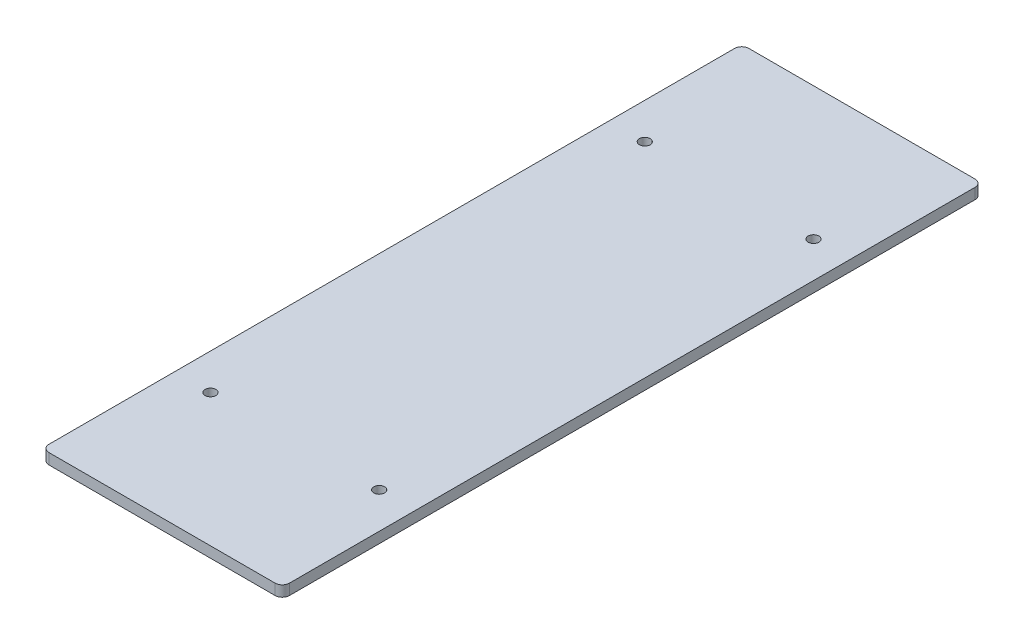
ISO-10303-21;
HEADER;
FILE_DESCRIPTION(('STEP AP214'),'2;1');
FILE_NAME('part.step','',(''),(''),'','','');
FILE_SCHEMA(('AUTOMOTIVE_DESIGN { 1 0 10303 214 1 1 1 1 }'));
ENDSEC;
DATA;
#1=APPLICATION_CONTEXT('core data for automotive mechanical design processes');
#2=APPLICATION_PROTOCOL_DEFINITION('international standard','automotive_design',2000,#1);
#3=PRODUCT_CONTEXT('',#1,'mechanical');
#4=PRODUCT('Part','Part','',(#3));
#5=PRODUCT_RELATED_PRODUCT_CATEGORY('part','',(#4));
#6=PRODUCT_DEFINITION_FORMATION('','',#4);
#7=PRODUCT_DEFINITION_CONTEXT('part definition',#1,'design');
#8=PRODUCT_DEFINITION('design','',#6,#7);
#9=PRODUCT_DEFINITION_SHAPE('','',#8);
#10=(LENGTH_UNIT() NAMED_UNIT(*) SI_UNIT(.MILLI.,.METRE.));
#11=(NAMED_UNIT(*) PLANE_ANGLE_UNIT() SI_UNIT($,.RADIAN.));
#12=(NAMED_UNIT(*) SI_UNIT($,.STERADIAN.) SOLID_ANGLE_UNIT());
#13=UNCERTAINTY_MEASURE_WITH_UNIT(LENGTH_MEASURE(1.E-05),#10,'distance_accuracy_value','');
#14=(GEOMETRIC_REPRESENTATION_CONTEXT(3) GLOBAL_UNCERTAINTY_ASSIGNED_CONTEXT((#13)) GLOBAL_UNIT_ASSIGNED_CONTEXT((#10,
#11,#12)) REPRESENTATION_CONTEXT('',''));
#15=CARTESIAN_POINT('',(0.,0.,0.));
#16=DIRECTION('',(0.,0.,1.));
#17=DIRECTION('',(1.,0.,0.));
#18=AXIS2_PLACEMENT_3D('',#15,#16,#17);
#19=CARTESIAN_POINT('',(0.,3.,0.));
#20=DIRECTION('',(0.,1.,0.));
#21=DIRECTION('',(0.,0.,1.));
#22=AXIS2_PLACEMENT_3D('',#19,#20,#21);
#23=PLANE('',#22);
#24=CARTESIAN_POINT('',(23.5,3.,60.5));
#25=DIRECTION('',(0.,1.,0.));
#26=DIRECTION('',(0.,0.,1.));
#27=AXIS2_PLACEMENT_3D('',#24,#25,#26);
#28=CIRCLE('',#27,1.5);
#29=CARTESIAN_POINT('',(23.5,3.,62.));
#30=VERTEX_POINT('',#29);
#31=EDGE_CURVE('E184',#30,#30,#28,.F.);
#32=ORIENTED_EDGE('',*,*,#31,.T.);
#33=EDGE_LOOP('',(#32));
#34=FACE_BOUND('',#33,.T.);
#35=CARTESIAN_POINT('',(-23.5,3.,-60.5));
#36=DIRECTION('',(0.,1.,0.));
#37=DIRECTION('',(0.,0.,1.));
#38=AXIS2_PLACEMENT_3D('',#35,#36,#37);
#39=CIRCLE('',#38,1.5);
#40=CARTESIAN_POINT('',(-23.5,3.,-59.));
#41=VERTEX_POINT('',#40);
#42=EDGE_CURVE('E178',#41,#41,#39,.F.);
#43=ORIENTED_EDGE('',*,*,#42,.T.);
#44=EDGE_LOOP('',(#43));
#45=FACE_BOUND('',#44,.T.);
#46=DIRECTION('',(0.,0.,-1.));
#47=VECTOR('',#46,1.);
#48=CARTESIAN_POINT('',(33.5,3.,-97.5));
#49=LINE('',#48,#47);
#50=CARTESIAN_POINT('',(33.5,3.,95.5));
#51=VERTEX_POINT('',#50);
#52=CARTESIAN_POINT('',(33.5,3.,-95.5));
#53=VERTEX_POINT('',#52);
#54=EDGE_CURVE('E138',#51,#53,#49,.T.);
#55=ORIENTED_EDGE('',*,*,#54,.T.);
#56=CARTESIAN_POINT('',(31.5,3.,-95.5));
#57=DIRECTION('',(0.,1.,0.));
#58=DIRECTION('',(0.,0.,1.));
#59=AXIS2_PLACEMENT_3D('',#56,#57,#58);
#60=CIRCLE('',#59,2.);
#61=CARTESIAN_POINT('',(31.5,3.,-97.5));
#62=VERTEX_POINT('',#61);
#63=EDGE_CURVE('E153',#53,#62,#60,.T.);
#64=ORIENTED_EDGE('',*,*,#63,.T.);
#65=DIRECTION('',(-1.,0.,0.));
#66=VECTOR('',#65,1.);
#67=CARTESIAN_POINT('',(-33.5,3.,-97.5));
#68=LINE('',#67,#66);
#69=CARTESIAN_POINT('',(-31.5,3.,-97.5));
#70=VERTEX_POINT('',#69);
#71=EDGE_CURVE('E120',#62,#70,#68,.T.);
#72=ORIENTED_EDGE('',*,*,#71,.T.);
#73=CARTESIAN_POINT('',(-31.5,3.,-95.5));
#74=DIRECTION('',(0.,1.,0.));
#75=DIRECTION('',(0.,0.,1.));
#76=AXIS2_PLACEMENT_3D('',#73,#74,#75);
#77=CIRCLE('',#76,2.);
#78=CARTESIAN_POINT('',(-33.5,3.,-95.5));
#79=VERTEX_POINT('',#78);
#80=EDGE_CURVE('E148',#70,#79,#77,.T.);
#81=ORIENTED_EDGE('',*,*,#80,.T.);
#82=DIRECTION('',(0.,0.,1.));
#83=VECTOR('',#82,1.);
#84=CARTESIAN_POINT('',(-33.5,3.,-97.5));
#85=LINE('',#84,#83);
#86=CARTESIAN_POINT('',(-33.5,3.,95.5));
#87=VERTEX_POINT('',#86);
#88=EDGE_CURVE('E164',#79,#87,#85,.T.);
#89=ORIENTED_EDGE('',*,*,#88,.T.);
#90=CARTESIAN_POINT('',(-31.5,3.,95.5));
#91=DIRECTION('',(0.,1.,0.));
#92=DIRECTION('',(0.,0.,1.));
#93=AXIS2_PLACEMENT_3D('',#90,#91,#92);
#94=CIRCLE('',#93,2.);
#95=CARTESIAN_POINT('',(-31.5,3.,97.5));
#96=VERTEX_POINT('',#95);
#97=EDGE_CURVE('E56',#87,#96,#94,.T.);
#98=ORIENTED_EDGE('',*,*,#97,.T.);
#99=DIRECTION('',(1.,0.,0.));
#100=VECTOR('',#99,1.);
#101=CARTESIAN_POINT('',(-33.5,3.,97.5));
#102=LINE('',#101,#100);
#103=CARTESIAN_POINT('',(31.5,3.,97.5));
#104=VERTEX_POINT('',#103);
#105=EDGE_CURVE('E139',#96,#104,#102,.T.);
#106=ORIENTED_EDGE('',*,*,#105,.T.);
#107=CARTESIAN_POINT('',(31.5,3.,95.5));
#108=DIRECTION('',(0.,1.,0.));
#109=DIRECTION('',(0.,0.,1.));
#110=AXIS2_PLACEMENT_3D('',#107,#108,#109);
#111=CIRCLE('',#110,2.);
#112=EDGE_CURVE('E151',#104,#51,#111,.T.);
#113=ORIENTED_EDGE('',*,*,#112,.T.);
#114=EDGE_LOOP('',(#55,#64,#72,#81,#89,#98,#106,#113));
#115=FACE_BOUND('',#114,.T.);
#116=CARTESIAN_POINT('',(-23.5,3.,60.5));
#117=DIRECTION('',(0.,1.,0.));
#118=DIRECTION('',(0.,0.,1.));
#119=AXIS2_PLACEMENT_3D('',#116,#117,#118);
#120=CIRCLE('',#119,1.5);
#121=CARTESIAN_POINT('',(-23.5,3.,62.));
#122=VERTEX_POINT('',#121);
#123=EDGE_CURVE('E190',#122,#122,#120,.T.);
#124=ORIENTED_EDGE('',*,*,#123,.F.);
#125=EDGE_LOOP('',(#124));
#126=FACE_BOUND('',#125,.T.);
#127=CARTESIAN_POINT('',(23.5,3.,-60.5));
#128=DIRECTION('',(0.,1.,0.));
#129=DIRECTION('',(0.,0.,1.));
#130=AXIS2_PLACEMENT_3D('',#127,#128,#129);
#131=CIRCLE('',#130,1.5);
#132=CARTESIAN_POINT('',(23.5,3.,-59.));
#133=VERTEX_POINT('',#132);
#134=EDGE_CURVE('E196',#133,#133,#131,.T.);
#135=ORIENTED_EDGE('',*,*,#134,.F.);
#136=EDGE_LOOP('',(#135));
#137=FACE_BOUND('',#136,.T.);
#138=ADVANCED_FACE('F34',(#34,#45,#115,#126,#137),#23,.T.);
#139=CARTESIAN_POINT('',(0.,0.,0.));
#140=DIRECTION('',(0.,1.,0.));
#141=DIRECTION('',(0.,0.,1.));
#142=AXIS2_PLACEMENT_3D('',#139,#140,#141);
#143=PLANE('',#142);
#144=CARTESIAN_POINT('',(-23.5,0.,60.5));
#145=DIRECTION('',(0.,1.,0.));
#146=DIRECTION('',(0.,0.,1.));
#147=AXIS2_PLACEMENT_3D('',#144,#145,#146);
#148=CIRCLE('',#147,1.5);
#149=CARTESIAN_POINT('',(-23.5,0.,62.));
#150=VERTEX_POINT('',#149);
#151=EDGE_CURVE('E193',#150,#150,#148,.T.);
#152=ORIENTED_EDGE('',*,*,#151,.T.);
#153=EDGE_LOOP('',(#152));
#154=FACE_BOUND('',#153,.T.);
#155=CARTESIAN_POINT('',(23.5,0.,60.5));
#156=DIRECTION('',(0.,1.,0.));
#157=DIRECTION('',(0.,0.,1.));
#158=AXIS2_PLACEMENT_3D('',#155,#156,#157);
#159=CIRCLE('',#158,1.5);
#160=CARTESIAN_POINT('',(23.5,0.,62.));
#161=VERTEX_POINT('',#160);
#162=EDGE_CURVE('E187',#161,#161,#159,.F.);
#163=ORIENTED_EDGE('',*,*,#162,.F.);
#164=EDGE_LOOP('',(#163));
#165=FACE_BOUND('',#164,.T.);
#166=CARTESIAN_POINT('',(-23.5,0.,-60.5));
#167=DIRECTION('',(0.,1.,0.));
#168=DIRECTION('',(0.,0.,1.));
#169=AXIS2_PLACEMENT_3D('',#166,#167,#168);
#170=CIRCLE('',#169,1.5);
#171=CARTESIAN_POINT('',(-23.5,0.,-59.));
#172=VERTEX_POINT('',#171);
#173=EDGE_CURVE('E133',#172,#172,#170,.F.);
#174=ORIENTED_EDGE('',*,*,#173,.F.);
#175=EDGE_LOOP('',(#174));
#176=FACE_BOUND('',#175,.T.);
#177=DIRECTION('',(-1.,0.,0.));
#178=VECTOR('',#177,1.);
#179=CARTESIAN_POINT('',(-33.5,0.,-97.5));
#180=LINE('',#179,#178);
#181=CARTESIAN_POINT('',(31.5,0.,-97.5));
#182=VERTEX_POINT('',#181);
#183=CARTESIAN_POINT('',(-31.5,0.,-97.5));
#184=VERTEX_POINT('',#183);
#185=EDGE_CURVE('E117',#182,#184,#180,.T.);
#186=ORIENTED_EDGE('',*,*,#185,.F.);
#187=CARTESIAN_POINT('',(31.5,0.,-95.5));
#188=DIRECTION('',(0.,1.,0.));
#189=DIRECTION('',(0.,0.,1.));
#190=AXIS2_PLACEMENT_3D('',#187,#188,#189);
#191=CIRCLE('',#190,2.);
#192=CARTESIAN_POINT('',(33.5,0.,-95.5));
#193=VERTEX_POINT('',#192);
#194=EDGE_CURVE('E100',#182,#193,#191,.F.);
#195=ORIENTED_EDGE('',*,*,#194,.T.);
#196=DIRECTION('',(0.,0.,-1.));
#197=VECTOR('',#196,1.);
#198=CARTESIAN_POINT('',(33.5,0.,-97.5));
#199=LINE('',#198,#197);
#200=CARTESIAN_POINT('',(33.5,0.,95.5));
#201=VERTEX_POINT('',#200);
#202=EDGE_CURVE('E128',#201,#193,#199,.T.);
#203=ORIENTED_EDGE('',*,*,#202,.F.);
#204=CARTESIAN_POINT('',(31.5,0.,95.5));
#205=DIRECTION('',(0.,1.,0.));
#206=DIRECTION('',(0.,0.,1.));
#207=AXIS2_PLACEMENT_3D('',#204,#205,#206);
#208=CIRCLE('',#207,2.);
#209=CARTESIAN_POINT('',(31.5,0.,97.5));
#210=VERTEX_POINT('',#209);
#211=EDGE_CURVE('E111',#201,#210,#208,.F.);
#212=ORIENTED_EDGE('',*,*,#211,.T.);
#213=DIRECTION('',(1.,0.,0.));
#214=VECTOR('',#213,1.);
#215=CARTESIAN_POINT('',(-33.5,0.,97.5));
#216=LINE('',#215,#214);
#217=CARTESIAN_POINT('',(-31.5,0.,97.5));
#218=VERTEX_POINT('',#217);
#219=EDGE_CURVE('E131',#218,#210,#216,.T.);
#220=ORIENTED_EDGE('',*,*,#219,.F.);
#221=CARTESIAN_POINT('',(-31.5,0.,95.5));
#222=DIRECTION('',(0.,1.,0.));
#223=DIRECTION('',(0.,0.,1.));
#224=AXIS2_PLACEMENT_3D('',#221,#222,#223);
#225=CIRCLE('',#224,2.);
#226=CARTESIAN_POINT('',(-33.5,0.,95.5));
#227=VERTEX_POINT('',#226);
#228=EDGE_CURVE('E142',#218,#227,#225,.F.);
#229=ORIENTED_EDGE('',*,*,#228,.T.);
#230=DIRECTION('',(0.,0.,1.));
#231=VECTOR('',#230,1.);
#232=CARTESIAN_POINT('',(-33.5,0.,-97.5));
#233=LINE('',#232,#231);
#234=CARTESIAN_POINT('',(-33.5,0.,-95.5));
#235=VERTEX_POINT('',#234);
#236=EDGE_CURVE('E127',#235,#227,#233,.T.);
#237=ORIENTED_EDGE('',*,*,#236,.F.);
#238=CARTESIAN_POINT('',(-31.5,0.,-95.5));
#239=DIRECTION('',(0.,1.,0.));
#240=DIRECTION('',(0.,0.,1.));
#241=AXIS2_PLACEMENT_3D('',#238,#239,#240);
#242=CIRCLE('',#241,2.);
#243=EDGE_CURVE('E121',#235,#184,#242,.F.);
#244=ORIENTED_EDGE('',*,*,#243,.T.);
#245=EDGE_LOOP('',(#186,#195,#203,#212,#220,#229,#237,#244));
#246=FACE_BOUND('',#245,.T.);
#247=CARTESIAN_POINT('',(23.5,0.,-60.5));
#248=DIRECTION('',(0.,1.,0.));
#249=DIRECTION('',(0.,0.,1.));
#250=AXIS2_PLACEMENT_3D('',#247,#248,#249);
#251=CIRCLE('',#250,1.5);
#252=CARTESIAN_POINT('',(23.5,0.,-59.));
#253=VERTEX_POINT('',#252);
#254=EDGE_CURVE('E181',#253,#253,#251,.T.);
#255=ORIENTED_EDGE('',*,*,#254,.T.);
#256=EDGE_LOOP('',(#255));
#257=FACE_BOUND('',#256,.T.);
#258=ADVANCED_FACE('F124',(#154,#165,#176,#246,#257),#143,.F.);
#259=CARTESIAN_POINT('',(33.5,3.,-97.5));
#260=DIRECTION('',(-1.,0.,0.));
#261=DIRECTION('',(0.,0.,1.));
#262=AXIS2_PLACEMENT_3D('',#259,#260,#261);
#263=PLANE('',#262);
#264=ORIENTED_EDGE('',*,*,#202,.T.);
#265=DIRECTION('',(0.,-1.,0.));
#266=VECTOR('',#265,1.);
#267=CARTESIAN_POINT('',(33.5,3.,-95.5));
#268=LINE('',#267,#266);
#269=EDGE_CURVE('E105',#193,#53,#268,.F.);
#270=ORIENTED_EDGE('',*,*,#269,.T.);
#271=ORIENTED_EDGE('',*,*,#54,.F.);
#272=DIRECTION('',(0.,-1.,0.));
#273=VECTOR('',#272,1.);
#274=CARTESIAN_POINT('',(33.5,3.,95.5));
#275=LINE('',#274,#273);
#276=EDGE_CURVE('E110',#51,#201,#275,.T.);
#277=ORIENTED_EDGE('',*,*,#276,.T.);
#278=EDGE_LOOP('',(#264,#270,#271,#277));
#279=FACE_BOUND('',#278,.T.);
#280=ADVANCED_FACE('F215',(#279),#263,.F.);
#281=CARTESIAN_POINT('',(-33.5,3.,-97.5));
#282=DIRECTION('',(0.,0.,1.));
#283=DIRECTION('',(1.,0.,0.));
#284=AXIS2_PLACEMENT_3D('',#281,#282,#283);
#285=PLANE('',#284);
#286=ORIENTED_EDGE('',*,*,#71,.F.);
#287=DIRECTION('',(0.,-1.,0.));
#288=VECTOR('',#287,1.);
#289=CARTESIAN_POINT('',(31.5,3.,-97.5));
#290=LINE('',#289,#288);
#291=EDGE_CURVE('E104',#62,#182,#290,.T.);
#292=ORIENTED_EDGE('',*,*,#291,.T.);
#293=ORIENTED_EDGE('',*,*,#185,.T.);
#294=DIRECTION('',(0.,-1.,0.));
#295=VECTOR('',#294,1.);
#296=CARTESIAN_POINT('',(-31.5,3.,-97.5));
#297=LINE('',#296,#295);
#298=EDGE_CURVE('E122',#184,#70,#297,.F.);
#299=ORIENTED_EDGE('',*,*,#298,.T.);
#300=EDGE_LOOP('',(#286,#292,#293,#299));
#301=FACE_BOUND('',#300,.T.);
#302=ADVANCED_FACE('F116',(#301),#285,.F.);
#303=CARTESIAN_POINT('',(-33.5,3.,-97.5));
#304=DIRECTION('',(1.,0.,0.));
#305=DIRECTION('',(0.,0.,-1.));
#306=AXIS2_PLACEMENT_3D('',#303,#304,#305);
#307=PLANE('',#306);
#308=ORIENTED_EDGE('',*,*,#236,.T.);
#309=DIRECTION('',(0.,-1.,0.));
#310=VECTOR('',#309,1.);
#311=CARTESIAN_POINT('',(-33.5,3.,95.5));
#312=LINE('',#311,#310);
#313=EDGE_CURVE('E11',#227,#87,#312,.F.);
#314=ORIENTED_EDGE('',*,*,#313,.T.);
#315=ORIENTED_EDGE('',*,*,#88,.F.);
#316=DIRECTION('',(0.,-1.,0.));
#317=VECTOR('',#316,1.);
#318=CARTESIAN_POINT('',(-33.5,3.,-95.5));
#319=LINE('',#318,#317);
#320=EDGE_CURVE('E42',#79,#235,#319,.T.);
#321=ORIENTED_EDGE('',*,*,#320,.T.);
#322=EDGE_LOOP('',(#308,#314,#315,#321));
#323=FACE_BOUND('',#322,.T.);
#324=ADVANCED_FACE('F162',(#323),#307,.F.);
#325=CARTESIAN_POINT('',(-33.5,3.,97.5));
#326=DIRECTION('',(0.,0.,-1.));
#327=DIRECTION('',(-1.,0.,0.));
#328=AXIS2_PLACEMENT_3D('',#325,#326,#327);
#329=PLANE('',#328);
#330=ORIENTED_EDGE('',*,*,#219,.T.);
#331=DIRECTION('',(0.,-1.,0.));
#332=VECTOR('',#331,1.);
#333=CARTESIAN_POINT('',(31.5,3.,97.5));
#334=LINE('',#333,#332);
#335=EDGE_CURVE('E49',#210,#104,#334,.F.);
#336=ORIENTED_EDGE('',*,*,#335,.T.);
#337=ORIENTED_EDGE('',*,*,#105,.F.);
#338=DIRECTION('',(0.,-1.,0.));
#339=VECTOR('',#338,1.);
#340=CARTESIAN_POINT('',(-31.5,3.,97.5));
#341=LINE('',#340,#339);
#342=EDGE_CURVE('E155',#96,#218,#341,.T.);
#343=ORIENTED_EDGE('',*,*,#342,.T.);
#344=EDGE_LOOP('',(#330,#336,#337,#343));
#345=FACE_BOUND('',#344,.T.);
#346=ADVANCED_FACE('F171',(#345),#329,.F.);
#347=CARTESIAN_POINT('',(-23.5,0.,-60.5));
#348=DIRECTION('',(0.,1.,0.));
#349=DIRECTION('',(0.,0.,1.));
#350=AXIS2_PLACEMENT_3D('',#347,#348,#349);
#351=CYLINDRICAL_SURFACE('',#350,1.5);
#352=ORIENTED_EDGE('',*,*,#173,.T.);
#353=EDGE_LOOP('',(#352));
#354=FACE_BOUND('',#353,.T.);
#355=ORIENTED_EDGE('',*,*,#42,.F.);
#356=EDGE_LOOP('',(#355));
#357=FACE_BOUND('',#356,.T.);
#358=ADVANCED_FACE('F220',(#354,#357),#351,.F.);
#359=CARTESIAN_POINT('',(23.5,0.,60.5));
#360=DIRECTION('',(0.,1.,0.));
#361=DIRECTION('',(0.,0.,1.));
#362=AXIS2_PLACEMENT_3D('',#359,#360,#361);
#363=CYLINDRICAL_SURFACE('',#362,1.5);
#364=ORIENTED_EDGE('',*,*,#162,.T.);
#365=EDGE_LOOP('',(#364));
#366=FACE_BOUND('',#365,.T.);
#367=ORIENTED_EDGE('',*,*,#31,.F.);
#368=EDGE_LOOP('',(#367));
#369=FACE_BOUND('',#368,.T.);
#370=ADVANCED_FACE('F249',(#366,#369),#363,.F.);
#371=CARTESIAN_POINT('',(-23.5,0.,60.5));
#372=DIRECTION('',(0.,1.,0.));
#373=DIRECTION('',(0.,0.,1.));
#374=AXIS2_PLACEMENT_3D('',#371,#372,#373);
#375=CYLINDRICAL_SURFACE('',#374,1.5);
#376=ORIENTED_EDGE('',*,*,#151,.F.);
#377=EDGE_LOOP('',(#376));
#378=FACE_BOUND('',#377,.T.);
#379=ORIENTED_EDGE('',*,*,#123,.T.);
#380=EDGE_LOOP('',(#379));
#381=FACE_BOUND('',#380,.T.);
#382=ADVANCED_FACE('F205',(#378,#381),#375,.F.);
#383=CARTESIAN_POINT('',(23.5,0.,-60.5));
#384=DIRECTION('',(0.,1.,0.));
#385=DIRECTION('',(0.,0.,1.));
#386=AXIS2_PLACEMENT_3D('',#383,#384,#385);
#387=CYLINDRICAL_SURFACE('',#386,1.5);
#388=ORIENTED_EDGE('',*,*,#254,.F.);
#389=EDGE_LOOP('',(#388));
#390=FACE_BOUND('',#389,.T.);
#391=ORIENTED_EDGE('',*,*,#134,.T.);
#392=EDGE_LOOP('',(#391));
#393=FACE_BOUND('',#392,.T.);
#394=ADVANCED_FACE('F202',(#390,#393),#387,.F.);
#395=CARTESIAN_POINT('',(31.5,3.,-95.5));
#396=DIRECTION('',(0.,-1.,0.));
#397=DIRECTION('',(0.,0.,-1.));
#398=AXIS2_PLACEMENT_3D('',#395,#396,#397);
#399=CYLINDRICAL_SURFACE('',#398,2.);
#400=ORIENTED_EDGE('',*,*,#63,.F.);
#401=ORIENTED_EDGE('',*,*,#269,.F.);
#402=ORIENTED_EDGE('',*,*,#194,.F.);
#403=ORIENTED_EDGE('',*,*,#291,.F.);
#404=EDGE_LOOP('',(#400,#401,#402,#403));
#405=FACE_BOUND('',#404,.T.);
#406=ADVANCED_FACE('F103',(#405),#399,.T.);
#407=CARTESIAN_POINT('',(31.5,3.,95.5));
#408=DIRECTION('',(0.,-1.,0.));
#409=DIRECTION('',(0.,0.,-1.));
#410=AXIS2_PLACEMENT_3D('',#407,#408,#409);
#411=CYLINDRICAL_SURFACE('',#410,2.);
#412=ORIENTED_EDGE('',*,*,#112,.F.);
#413=ORIENTED_EDGE('',*,*,#335,.F.);
#414=ORIENTED_EDGE('',*,*,#211,.F.);
#415=ORIENTED_EDGE('',*,*,#276,.F.);
#416=EDGE_LOOP('',(#412,#413,#414,#415));
#417=FACE_BOUND('',#416,.T.);
#418=ADVANCED_FACE('F234',(#417),#411,.T.);
#419=CARTESIAN_POINT('',(-31.5,3.,95.5));
#420=DIRECTION('',(0.,-1.,0.));
#421=DIRECTION('',(0.,0.,-1.));
#422=AXIS2_PLACEMENT_3D('',#419,#420,#421);
#423=CYLINDRICAL_SURFACE('',#422,2.);
#424=ORIENTED_EDGE('',*,*,#97,.F.);
#425=ORIENTED_EDGE('',*,*,#313,.F.);
#426=ORIENTED_EDGE('',*,*,#228,.F.);
#427=ORIENTED_EDGE('',*,*,#342,.F.);
#428=EDGE_LOOP('',(#424,#425,#426,#427));
#429=FACE_BOUND('',#428,.T.);
#430=ADVANCED_FACE('F170',(#429),#423,.T.);
#431=CARTESIAN_POINT('',(-31.5,3.,-95.5));
#432=DIRECTION('',(0.,-1.,0.));
#433=DIRECTION('',(0.,0.,-1.));
#434=AXIS2_PLACEMENT_3D('',#431,#432,#433);
#435=CYLINDRICAL_SURFACE('',#434,2.);
#436=ORIENTED_EDGE('',*,*,#80,.F.);
#437=ORIENTED_EDGE('',*,*,#298,.F.);
#438=ORIENTED_EDGE('',*,*,#243,.F.);
#439=ORIENTED_EDGE('',*,*,#320,.F.);
#440=EDGE_LOOP('',(#436,#437,#438,#439));
#441=FACE_BOUND('',#440,.T.);
#442=ADVANCED_FACE('F36',(#441),#435,.T.);
#443=CLOSED_SHELL('',(#138,#258,#280,#302,#324,#346,#358,#370,#382,#394,#406,#418,#430,#442));
#444=MANIFOLD_SOLID_BREP('B2',#443);
#445=ADVANCED_BREP_SHAPE_REPRESENTATION('',(#18,#444),#14);
#446=SHAPE_DEFINITION_REPRESENTATION(#9,#445);
ENDSEC;
END-ISO-10303-21;
